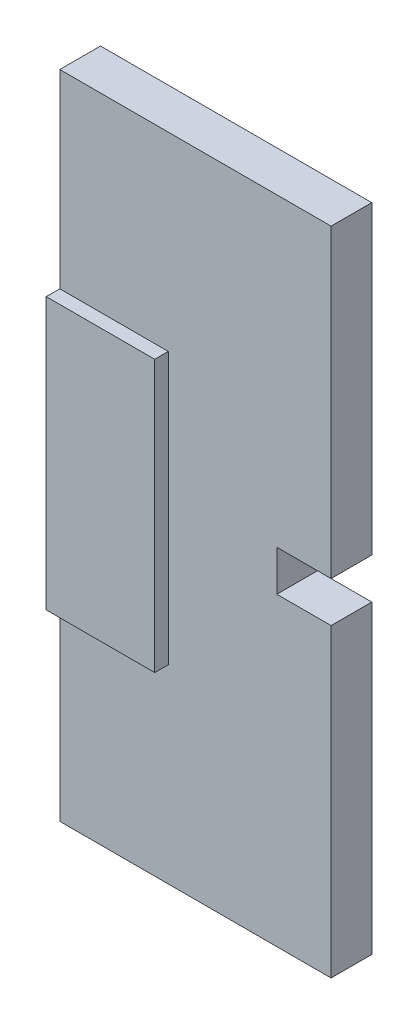
ISO-10303-21;
HEADER;
FILE_DESCRIPTION(('STEP AP214'),'2;1');
FILE_NAME('part.step','',(''),(''),'','','');
FILE_SCHEMA(('AUTOMOTIVE_DESIGN { 1 0 10303 214 1 1 1 1 }'));
ENDSEC;
DATA;
#1=APPLICATION_CONTEXT('core data for automotive mechanical design processes');
#2=APPLICATION_PROTOCOL_DEFINITION('international standard','automotive_design',2000,#1);
#3=PRODUCT_CONTEXT('',#1,'mechanical');
#4=PRODUCT('Part','Part','',(#3));
#5=PRODUCT_RELATED_PRODUCT_CATEGORY('part','',(#4));
#6=PRODUCT_DEFINITION_FORMATION('','',#4);
#7=PRODUCT_DEFINITION_CONTEXT('part definition',#1,'design');
#8=PRODUCT_DEFINITION('design','',#6,#7);
#9=PRODUCT_DEFINITION_SHAPE('','',#8);
#10=(LENGTH_UNIT() NAMED_UNIT(*) SI_UNIT(.MILLI.,.METRE.));
#11=(NAMED_UNIT(*) PLANE_ANGLE_UNIT() SI_UNIT($,.RADIAN.));
#12=(NAMED_UNIT(*) SI_UNIT($,.STERADIAN.) SOLID_ANGLE_UNIT());
#13=UNCERTAINTY_MEASURE_WITH_UNIT(LENGTH_MEASURE(1.E-05),#10,'distance_accuracy_value','');
#14=(GEOMETRIC_REPRESENTATION_CONTEXT(3) GLOBAL_UNCERTAINTY_ASSIGNED_CONTEXT((#13)) GLOBAL_UNIT_ASSIGNED_CONTEXT((#10,
#11,#12)) REPRESENTATION_CONTEXT('',''));
#15=CARTESIAN_POINT('',(0.,0.,0.));
#16=DIRECTION('',(0.,0.,1.));
#17=DIRECTION('',(1.,0.,0.));
#18=AXIS2_PLACEMENT_3D('',#15,#16,#17);
#19=CARTESIAN_POINT('',(0.,-25.0476177130045,4.7625));
#20=DIRECTION('',(0.,1.,0.));
#21=DIRECTION('',(0.,0.,1.));
#22=AXIS2_PLACEMENT_3D('',#19,#20,#21);
#23=PLANE('',#22);
#24=DIRECTION('',(0.,0.,1.));
#25=VECTOR('',#24,1.);
#26=CARTESIAN_POINT('',(37.445067264574,-25.0476177130045,-4.8895));
#27=LINE('',#26,#25);
#28=CARTESIAN_POINT('',(37.445067264574,-25.0476177130045,0.));
#29=VERTEX_POINT('',#28);
#30=CARTESIAN_POINT('',(37.445067264574,-25.0476177130045,4.7625));
#31=VERTEX_POINT('',#30);
#32=EDGE_CURVE('E129',#29,#31,#27,.T.);
#33=ORIENTED_EDGE('',*,*,#32,.F.);
#34=DIRECTION('',(1.,0.,0.));
#35=VECTOR('',#34,1.);
#36=CARTESIAN_POINT('',(0.,-25.0476177130045,0.));
#37=LINE('',#36,#35);
#38=CARTESIAN_POINT('',(31.095067264574,-25.0476177130045,0.));
#39=VERTEX_POINT('',#38);
#40=EDGE_CURVE('E180',#39,#29,#37,.T.);
#41=ORIENTED_EDGE('',*,*,#40,.F.);
#42=DIRECTION('',(0.,0.,-1.));
#43=VECTOR('',#42,1.);
#44=CARTESIAN_POINT('',(31.095067264574,-25.0476177130045,4.7625));
#45=LINE('',#44,#43);
#46=CARTESIAN_POINT('',(31.095067264574,-25.0476177130045,4.7625));
#47=VERTEX_POINT('',#46);
#48=EDGE_CURVE('E150',#47,#39,#45,.T.);
#49=ORIENTED_EDGE('',*,*,#48,.F.);
#50=DIRECTION('',(1.,0.,0.));
#51=VECTOR('',#50,1.);
#52=CARTESIAN_POINT('',(0.,-25.0476177130045,4.7625));
#53=LINE('',#52,#51);
#54=EDGE_CURVE('E144',#47,#31,#53,.T.);
#55=ORIENTED_EDGE('',*,*,#54,.T.);
#56=EDGE_LOOP('',(#33,#41,#49,#55));
#57=FACE_BOUND('',#56,.T.);
#58=ADVANCED_FACE('F43',(#57),#23,.T.);
#59=CARTESIAN_POINT('',(31.095067264574,0.,4.7625));
#60=DIRECTION('',(1.,0.,0.));
#61=DIRECTION('',(0.,1.,0.));
#62=AXIS2_PLACEMENT_3D('',#59,#60,#61);
#63=PLANE('',#62);
#64=DIRECTION('',(0.,-1.,0.));
#65=VECTOR('',#64,1.);
#66=CARTESIAN_POINT('',(31.095067264574,0.,0.));
#67=LINE('',#66,#65);
#68=CARTESIAN_POINT('',(31.095067264574,-20.2851177130045,0.));
#69=VERTEX_POINT('',#68);
#70=EDGE_CURVE('E183',#69,#39,#67,.T.);
#71=ORIENTED_EDGE('',*,*,#70,.F.);
#72=DIRECTION('',(0.,0.,-1.));
#73=VECTOR('',#72,1.);
#74=CARTESIAN_POINT('',(31.095067264574,-20.2851177130045,4.7625));
#75=LINE('',#74,#73);
#76=CARTESIAN_POINT('',(31.095067264574,-20.2851177130045,4.7625));
#77=VERTEX_POINT('',#76);
#78=EDGE_CURVE('E202',#77,#69,#75,.T.);
#79=ORIENTED_EDGE('',*,*,#78,.F.);
#80=DIRECTION('',(0.,-1.,0.));
#81=VECTOR('',#80,1.);
#82=CARTESIAN_POINT('',(31.095067264574,0.,4.7625));
#83=LINE('',#82,#81);
#84=EDGE_CURVE('E152',#77,#47,#83,.T.);
#85=ORIENTED_EDGE('',*,*,#84,.T.);
#86=ORIENTED_EDGE('',*,*,#48,.T.);
#87=EDGE_LOOP('',(#71,#79,#85,#86));
#88=FACE_BOUND('',#87,.T.);
#89=ADVANCED_FACE('F220',(#88),#63,.T.);
#90=CARTESIAN_POINT('',(0.,-20.2851177130045,4.7625));
#91=DIRECTION('',(0.,-1.,0.));
#92=DIRECTION('',(0.,0.,-1.));
#93=AXIS2_PLACEMENT_3D('',#90,#91,#92);
#94=PLANE('',#93);
#95=DIRECTION('',(0.,0.,1.));
#96=VECTOR('',#95,1.);
#97=CARTESIAN_POINT('',(37.445067264574,-20.2851177130045,-4.8895));
#98=LINE('',#97,#96);
#99=CARTESIAN_POINT('',(37.445067264574,-20.2851177130045,0.));
#100=VERTEX_POINT('',#99);
#101=CARTESIAN_POINT('',(37.445067264574,-20.2851177130045,4.7625));
#102=VERTEX_POINT('',#101);
#103=EDGE_CURVE('E58',#100,#102,#98,.T.);
#104=ORIENTED_EDGE('',*,*,#103,.T.);
#105=DIRECTION('',(-1.,0.,0.));
#106=VECTOR('',#105,1.);
#107=CARTESIAN_POINT('',(0.,-20.2851177130045,4.7625));
#108=LINE('',#107,#106);
#109=EDGE_CURVE('E157',#102,#77,#108,.T.);
#110=ORIENTED_EDGE('',*,*,#109,.T.);
#111=ORIENTED_EDGE('',*,*,#78,.T.);
#112=DIRECTION('',(-1.,0.,0.));
#113=VECTOR('',#112,1.);
#114=CARTESIAN_POINT('',(0.,-20.2851177130045,0.));
#115=LINE('',#114,#113);
#116=EDGE_CURVE('E187',#100,#69,#115,.T.);
#117=ORIENTED_EDGE('',*,*,#116,.F.);
#118=EDGE_LOOP('',(#104,#110,#111,#117));
#119=FACE_BOUND('',#118,.T.);
#120=ADVANCED_FACE('F215',(#119),#94,.T.);
#121=CARTESIAN_POINT('',(0.,15.4336322869955,4.7625));
#122=DIRECTION('',(0.,1.,0.));
#123=DIRECTION('',(-1.,0.,0.));
#124=AXIS2_PLACEMENT_3D('',#121,#122,#123);
#125=PLANE('',#124);
#126=DIRECTION('',(0.,0.,1.));
#127=VECTOR('',#126,1.);
#128=CARTESIAN_POINT('',(37.445067264574,15.4336322869955,-4.8895));
#129=LINE('',#128,#127);
#130=CARTESIAN_POINT('',(37.445067264574,15.4336322869955,0.));
#131=VERTEX_POINT('',#130);
#132=CARTESIAN_POINT('',(37.445067264574,15.4336322869955,4.7625));
#133=VERTEX_POINT('',#132);
#134=EDGE_CURVE('E232',#131,#133,#129,.T.);
#135=ORIENTED_EDGE('',*,*,#134,.F.);
#136=DIRECTION('',(1.,0.,0.));
#137=VECTOR('',#136,1.);
#138=CARTESIAN_POINT('',(0.,15.4336322869955,0.));
#139=LINE('',#138,#137);
#140=CARTESIAN_POINT('',(5.69506726457397,15.4336322869955,0.));
#141=VERTEX_POINT('',#140);
#142=EDGE_CURVE('E190',#141,#131,#139,.T.);
#143=ORIENTED_EDGE('',*,*,#142,.F.);
#144=DIRECTION('',(0.,0.,-1.));
#145=VECTOR('',#144,1.);
#146=CARTESIAN_POINT('',(5.69506726457397,15.4336322869955,4.7625));
#147=LINE('',#146,#145);
#148=CARTESIAN_POINT('',(5.69506726457397,15.4336322869955,4.7625));
#149=VERTEX_POINT('',#148);
#150=EDGE_CURVE('E199',#149,#141,#147,.T.);
#151=ORIENTED_EDGE('',*,*,#150,.F.);
#152=DIRECTION('',(1.,0.,0.));
#153=VECTOR('',#152,1.);
#154=CARTESIAN_POINT('',(0.,15.4336322869955,4.7625));
#155=LINE('',#154,#153);
#156=EDGE_CURVE('E168',#149,#133,#155,.T.);
#157=ORIENTED_EDGE('',*,*,#156,.T.);
#158=EDGE_LOOP('',(#135,#143,#151,#157));
#159=FACE_BOUND('',#158,.T.);
#160=ADVANCED_FACE('F231',(#159),#125,.T.);
#161=CARTESIAN_POINT('',(5.69506726457397,0.,4.7625));
#162=DIRECTION('',(1.,0.,0.));
#163=DIRECTION('',(0.,1.,0.));
#164=AXIS2_PLACEMENT_3D('',#161,#162,#163);
#165=PLANE('',#164);
#166=DIRECTION('',(0.,-1.,0.));
#167=VECTOR('',#166,1.);
#168=CARTESIAN_POINT('',(5.69506726457397,0.,0.));
#169=LINE('',#168,#167);
#170=CARTESIAN_POINT('',(5.69506726457399,-60.7663677130045,0.));
#171=VERTEX_POINT('',#170);
#172=EDGE_CURVE('E160',#141,#171,#169,.T.);
#173=ORIENTED_EDGE('',*,*,#172,.T.);
#174=DIRECTION('',(0.,0.,-1.));
#175=VECTOR('',#174,1.);
#176=CARTESIAN_POINT('',(5.69506726457399,-60.7663677130045,4.7625));
#177=LINE('',#176,#175);
#178=CARTESIAN_POINT('',(5.69506726457399,-60.7663677130045,4.7625));
#179=VERTEX_POINT('',#178);
#180=EDGE_CURVE('E179',#179,#171,#177,.T.);
#181=ORIENTED_EDGE('',*,*,#180,.F.);
#182=DIRECTION('',(0.,-1.,0.));
#183=VECTOR('',#182,1.);
#184=CARTESIAN_POINT('',(5.69506726457397,0.,4.7625));
#185=LINE('',#184,#183);
#186=CARTESIAN_POINT('',(5.69506726457398,-38.5413677130045,4.7625));
#187=VERTEX_POINT('',#186);
#188=EDGE_CURVE('E172',#187,#179,#185,.T.);
#189=ORIENTED_EDGE('',*,*,#188,.F.);
#190=DIRECTION('',(0.,0.,-1.));
#191=VECTOR('',#190,1.);
#192=CARTESIAN_POINT('',(5.69506726457398,-38.5413677130045,6.35));
#193=LINE('',#192,#191);
#194=CARTESIAN_POINT('',(5.69506726457398,-38.5413677130045,6.35));
#195=VERTEX_POINT('',#194);
#196=EDGE_CURVE('E272',#195,#187,#193,.T.);
#197=ORIENTED_EDGE('',*,*,#196,.F.);
#198=DIRECTION('',(0.,-1.,0.));
#199=VECTOR('',#198,1.);
#200=CARTESIAN_POINT('',(5.69506726457397,0.,6.35));
#201=LINE('',#200,#199);
#202=CARTESIAN_POINT('',(5.69506726457397,-6.79136771300447,6.35));
#203=VERTEX_POINT('',#202);
#204=EDGE_CURVE('E252',#203,#195,#201,.T.);
#205=ORIENTED_EDGE('',*,*,#204,.F.);
#206=DIRECTION('',(0.,0.,-1.));
#207=VECTOR('',#206,1.);
#208=CARTESIAN_POINT('',(5.69506726457397,-6.79136771300447,6.35));
#209=LINE('',#208,#207);
#210=CARTESIAN_POINT('',(5.69506726457397,-6.79136771300447,4.7625));
#211=VERTEX_POINT('',#210);
#212=EDGE_CURVE('E274',#203,#211,#209,.T.);
#213=ORIENTED_EDGE('',*,*,#212,.T.);
#214=EDGE_CURVE('E173',#149,#211,#185,.T.);
#215=ORIENTED_EDGE('',*,*,#214,.F.);
#216=ORIENTED_EDGE('',*,*,#150,.T.);
#217=EDGE_LOOP('',(#173,#181,#189,#197,#205,#213,#215,#216));
#218=FACE_BOUND('',#217,.T.);
#219=ADVANCED_FACE('F227',(#218),#165,.F.);
#220=CARTESIAN_POINT('',(0.,-60.7663677130045,4.7625));
#221=DIRECTION('',(0.,1.,0.));
#222=DIRECTION('',(-1.,0.,0.));
#223=AXIS2_PLACEMENT_3D('',#220,#221,#222);
#224=PLANE('',#223);
#225=DIRECTION('',(1.,0.,0.));
#226=VECTOR('',#225,1.);
#227=CARTESIAN_POINT('',(0.,-60.7663677130045,0.));
#228=LINE('',#227,#226);
#229=CARTESIAN_POINT('',(37.445067264574,-60.7663677130045,0.));
#230=VERTEX_POINT('',#229);
#231=EDGE_CURVE('E153',#171,#230,#228,.T.);
#232=ORIENTED_EDGE('',*,*,#231,.T.);
#233=DIRECTION('',(0.,0.,1.));
#234=VECTOR('',#233,1.);
#235=CARTESIAN_POINT('',(37.445067264574,-60.7663677130045,-4.8895));
#236=LINE('',#235,#234);
#237=CARTESIAN_POINT('',(37.445067264574,-60.7663677130045,4.7625));
#238=VERTEX_POINT('',#237);
#239=EDGE_CURVE('E66',#230,#238,#236,.T.);
#240=ORIENTED_EDGE('',*,*,#239,.T.);
#241=DIRECTION('',(1.,0.,0.));
#242=VECTOR('',#241,1.);
#243=CARTESIAN_POINT('',(0.,-60.7663677130045,4.7625));
#244=LINE('',#243,#242);
#245=EDGE_CURVE('E147',#179,#238,#244,.T.);
#246=ORIENTED_EDGE('',*,*,#245,.F.);
#247=ORIENTED_EDGE('',*,*,#180,.T.);
#248=EDGE_LOOP('',(#232,#240,#246,#247));
#249=FACE_BOUND('',#248,.T.);
#250=ADVANCED_FACE('F223',(#249),#224,.F.);
#251=CARTESIAN_POINT('',(0.,0.,4.7625));
#252=DIRECTION('',(0.,0.,1.));
#253=DIRECTION('',(1.,0.,0.));
#254=AXIS2_PLACEMENT_3D('',#251,#252,#253);
#255=PLANE('',#254);
#256=DIRECTION('',(0.,-1.,0.));
#257=VECTOR('',#256,1.);
#258=CARTESIAN_POINT('',(37.445067264574,-60.7663677130045,4.7625));
#259=LINE('',#258,#257);
#260=EDGE_CURVE('E132',#31,#238,#259,.T.);
#261=ORIENTED_EDGE('',*,*,#260,.F.);
#262=ORIENTED_EDGE('',*,*,#54,.F.);
#263=ORIENTED_EDGE('',*,*,#84,.F.);
#264=ORIENTED_EDGE('',*,*,#109,.F.);
#265=DIRECTION('',(0.,-1.,0.));
#266=VECTOR('',#265,1.);
#267=CARTESIAN_POINT('',(37.445067264574,-20.2851177130045,4.7625));
#268=LINE('',#267,#266);
#269=EDGE_CURVE('E236',#133,#102,#268,.T.);
#270=ORIENTED_EDGE('',*,*,#269,.F.);
#271=ORIENTED_EDGE('',*,*,#156,.F.);
#272=ORIENTED_EDGE('',*,*,#214,.T.);
#273=DIRECTION('',(1.,0.,0.));
#274=VECTOR('',#273,1.);
#275=CARTESIAN_POINT('',(0.,-6.79136771300447,4.7625));
#276=LINE('',#275,#274);
#277=CARTESIAN_POINT('',(18.395067264574,-6.79136771300447,4.7625));
#278=VERTEX_POINT('',#277);
#279=EDGE_CURVE('E263',#211,#278,#276,.T.);
#280=ORIENTED_EDGE('',*,*,#279,.T.);
#281=DIRECTION('',(0.,-1.,0.));
#282=VECTOR('',#281,1.);
#283=CARTESIAN_POINT('',(18.395067264574,0.,4.7625));
#284=LINE('',#283,#282);
#285=CARTESIAN_POINT('',(18.395067264574,-38.5413677130045,4.7625));
#286=VERTEX_POINT('',#285);
#287=EDGE_CURVE('E259',#278,#286,#284,.T.);
#288=ORIENTED_EDGE('',*,*,#287,.T.);
#289=DIRECTION('',(1.,0.,0.));
#290=VECTOR('',#289,1.);
#291=CARTESIAN_POINT('',(0.,-38.5413677130045,4.7625));
#292=LINE('',#291,#290);
#293=EDGE_CURVE('E248',#187,#286,#292,.T.);
#294=ORIENTED_EDGE('',*,*,#293,.F.);
#295=ORIENTED_EDGE('',*,*,#188,.T.);
#296=ORIENTED_EDGE('',*,*,#245,.T.);
#297=EDGE_LOOP('',(#261,#262,#263,#264,#270,#271,#272,#280,#288,#294,#295,#296));
#298=FACE_BOUND('',#297,.T.);
#299=ADVANCED_FACE('F142',(#298),#255,.T.);
#300=CARTESIAN_POINT('',(0.,0.,0.));
#301=DIRECTION('',(0.,0.,1.));
#302=DIRECTION('',(1.,0.,0.));
#303=AXIS2_PLACEMENT_3D('',#300,#301,#302);
#304=PLANE('',#303);
#305=ORIENTED_EDGE('',*,*,#40,.T.);
#306=DIRECTION('',(0.,-1.,0.));
#307=VECTOR('',#306,1.);
#308=CARTESIAN_POINT('',(37.445067264574,0.,0.));
#309=LINE('',#308,#307);
#310=EDGE_CURVE('E11',#29,#230,#309,.T.);
#311=ORIENTED_EDGE('',*,*,#310,.T.);
#312=ORIENTED_EDGE('',*,*,#231,.F.);
#313=ORIENTED_EDGE('',*,*,#172,.F.);
#314=ORIENTED_EDGE('',*,*,#142,.T.);
#315=DIRECTION('',(0.,-1.,0.));
#316=VECTOR('',#315,1.);
#317=CARTESIAN_POINT('',(37.445067264574,0.,0.));
#318=LINE('',#317,#316);
#319=EDGE_CURVE('E51',#131,#100,#318,.T.);
#320=ORIENTED_EDGE('',*,*,#319,.T.);
#321=ORIENTED_EDGE('',*,*,#116,.T.);
#322=ORIENTED_EDGE('',*,*,#70,.T.);
#323=EDGE_LOOP('',(#305,#311,#312,#313,#314,#320,#321,#322));
#324=FACE_BOUND('',#323,.T.);
#325=ADVANCED_FACE('F210',(#324),#304,.F.);
#326=CARTESIAN_POINT('',(18.395067264574,0.,6.35));
#327=DIRECTION('',(1.,0.,0.));
#328=DIRECTION('',(0.,0.,-1.));
#329=AXIS2_PLACEMENT_3D('',#326,#327,#328);
#330=PLANE('',#329);
#331=ORIENTED_EDGE('',*,*,#287,.F.);
#332=DIRECTION('',(0.,0.,-1.));
#333=VECTOR('',#332,1.);
#334=CARTESIAN_POINT('',(18.395067264574,-6.79136771300447,6.35));
#335=LINE('',#334,#333);
#336=CARTESIAN_POINT('',(18.395067264574,-6.79136771300447,6.35));
#337=VERTEX_POINT('',#336);
#338=EDGE_CURVE('E163',#337,#278,#335,.T.);
#339=ORIENTED_EDGE('',*,*,#338,.F.);
#340=DIRECTION('',(0.,-1.,0.));
#341=VECTOR('',#340,1.);
#342=CARTESIAN_POINT('',(18.395067264574,0.,6.35));
#343=LINE('',#342,#341);
#344=CARTESIAN_POINT('',(18.395067264574,-38.5413677130045,6.35));
#345=VERTEX_POINT('',#344);
#346=EDGE_CURVE('E243',#337,#345,#343,.T.);
#347=ORIENTED_EDGE('',*,*,#346,.T.);
#348=DIRECTION('',(0.,0.,-1.));
#349=VECTOR('',#348,1.);
#350=CARTESIAN_POINT('',(18.395067264574,-38.5413677130045,6.35));
#351=LINE('',#350,#349);
#352=EDGE_CURVE('E258',#345,#286,#351,.T.);
#353=ORIENTED_EDGE('',*,*,#352,.T.);
#354=EDGE_LOOP('',(#331,#339,#347,#353));
#355=FACE_BOUND('',#354,.T.);
#356=ADVANCED_FACE('F315',(#355),#330,.T.);
#357=CARTESIAN_POINT('',(0.,-6.79136771300447,6.35));
#358=DIRECTION('',(0.,1.,0.));
#359=DIRECTION('',(0.,0.,1.));
#360=AXIS2_PLACEMENT_3D('',#357,#358,#359);
#361=PLANE('',#360);
#362=ORIENTED_EDGE('',*,*,#279,.F.);
#363=ORIENTED_EDGE('',*,*,#212,.F.);
#364=DIRECTION('',(1.,0.,0.));
#365=VECTOR('',#364,1.);
#366=CARTESIAN_POINT('',(0.,-6.79136771300447,6.35));
#367=LINE('',#366,#365);
#368=EDGE_CURVE('E247',#203,#337,#367,.T.);
#369=ORIENTED_EDGE('',*,*,#368,.T.);
#370=ORIENTED_EDGE('',*,*,#338,.T.);
#371=EDGE_LOOP('',(#362,#363,#369,#370));
#372=FACE_BOUND('',#371,.T.);
#373=ADVANCED_FACE('F281',(#372),#361,.T.);
#374=CARTESIAN_POINT('',(0.,-38.5413677130045,6.35));
#375=DIRECTION('',(0.,1.,0.));
#376=DIRECTION('',(0.,0.,1.));
#377=AXIS2_PLACEMENT_3D('',#374,#375,#376);
#378=PLANE('',#377);
#379=ORIENTED_EDGE('',*,*,#293,.T.);
#380=ORIENTED_EDGE('',*,*,#352,.F.);
#381=DIRECTION('',(1.,0.,0.));
#382=VECTOR('',#381,1.);
#383=CARTESIAN_POINT('',(0.,-38.5413677130045,6.35));
#384=LINE('',#383,#382);
#385=EDGE_CURVE('E255',#195,#345,#384,.T.);
#386=ORIENTED_EDGE('',*,*,#385,.F.);
#387=ORIENTED_EDGE('',*,*,#196,.T.);
#388=EDGE_LOOP('',(#379,#380,#386,#387));
#389=FACE_BOUND('',#388,.T.);
#390=ADVANCED_FACE('F295',(#389),#378,.F.);
#391=CARTESIAN_POINT('',(0.,0.,6.35));
#392=DIRECTION('',(0.,0.,1.));
#393=DIRECTION('',(1.,0.,0.));
#394=AXIS2_PLACEMENT_3D('',#391,#392,#393);
#395=PLANE('',#394);
#396=ORIENTED_EDGE('',*,*,#346,.F.);
#397=ORIENTED_EDGE('',*,*,#368,.F.);
#398=ORIENTED_EDGE('',*,*,#204,.T.);
#399=ORIENTED_EDGE('',*,*,#385,.T.);
#400=EDGE_LOOP('',(#396,#397,#398,#399));
#401=FACE_BOUND('',#400,.T.);
#402=ADVANCED_FACE('F288',(#401),#395,.T.);
#403=CARTESIAN_POINT('',(37.445067264574,-20.2851177130045,-4.8895));
#404=DIRECTION('',(-1.,0.,0.));
#405=DIRECTION('',(0.,0.,1.));
#406=AXIS2_PLACEMENT_3D('',#403,#404,#405);
#407=PLANE('',#406);
#408=ORIENTED_EDGE('',*,*,#134,.T.);
#409=ORIENTED_EDGE('',*,*,#269,.T.);
#410=ORIENTED_EDGE('',*,*,#103,.F.);
#411=ORIENTED_EDGE('',*,*,#319,.F.);
#412=EDGE_LOOP('',(#408,#409,#410,#411));
#413=FACE_BOUND('',#412,.T.);
#414=ADVANCED_FACE('F286',(#413),#407,.F.);
#415=CARTESIAN_POINT('',(37.445067264574,-60.7663677130045,-4.8895));
#416=DIRECTION('',(-1.,0.,0.));
#417=DIRECTION('',(0.,0.,1.));
#418=AXIS2_PLACEMENT_3D('',#415,#416,#417);
#419=PLANE('',#418);
#420=ORIENTED_EDGE('',*,*,#32,.T.);
#421=ORIENTED_EDGE('',*,*,#260,.T.);
#422=ORIENTED_EDGE('',*,*,#239,.F.);
#423=ORIENTED_EDGE('',*,*,#310,.F.);
#424=EDGE_LOOP('',(#420,#421,#422,#423));
#425=FACE_BOUND('',#424,.T.);
#426=ADVANCED_FACE('F131',(#425),#419,.F.);
#427=CLOSED_SHELL('',(#58,#89,#120,#160,#219,#250,#299,#325,#356,#373,#390,#402,#414,#426));
#428=MANIFOLD_SOLID_BREP('B2',#427);
#429=ADVANCED_BREP_SHAPE_REPRESENTATION('',(#18,#428),#14);
#430=SHAPE_DEFINITION_REPRESENTATION(#9,#429);
ENDSEC;
END-ISO-10303-21;
